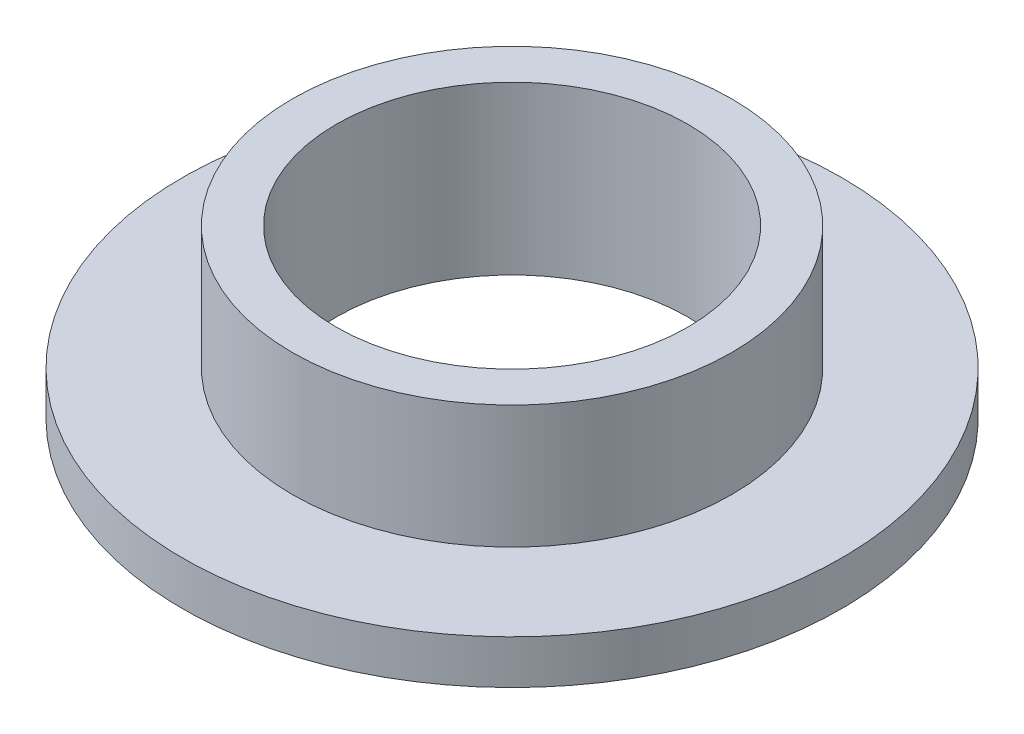
ISO-10303-21;
HEADER;
FILE_DESCRIPTION(('STEP AP214'),'2;1');
FILE_NAME('part.step','',(''),(''),'','','');
FILE_SCHEMA(('AUTOMOTIVE_DESIGN { 1 0 10303 214 1 1 1 1 }'));
ENDSEC;
DATA;
#1=APPLICATION_CONTEXT('core data for automotive mechanical design processes');
#2=APPLICATION_PROTOCOL_DEFINITION('international standard','automotive_design',2000,#1);
#3=PRODUCT_CONTEXT('',#1,'mechanical');
#4=PRODUCT('Part','Part','',(#3));
#5=PRODUCT_RELATED_PRODUCT_CATEGORY('part','',(#4));
#6=PRODUCT_DEFINITION_FORMATION('','',#4);
#7=PRODUCT_DEFINITION_CONTEXT('part definition',#1,'design');
#8=PRODUCT_DEFINITION('design','',#6,#7);
#9=PRODUCT_DEFINITION_SHAPE('','',#8);
#10=(LENGTH_UNIT() NAMED_UNIT(*) SI_UNIT(.MILLI.,.METRE.));
#11=(NAMED_UNIT(*) PLANE_ANGLE_UNIT() SI_UNIT($,.RADIAN.));
#12=(NAMED_UNIT(*) SI_UNIT($,.STERADIAN.) SOLID_ANGLE_UNIT());
#13=UNCERTAINTY_MEASURE_WITH_UNIT(LENGTH_MEASURE(1.E-05),#10,'distance_accuracy_value','');
#14=(GEOMETRIC_REPRESENTATION_CONTEXT(3) GLOBAL_UNCERTAINTY_ASSIGNED_CONTEXT((#13)) GLOBAL_UNIT_ASSIGNED_CONTEXT((#10,
#11,#12)) REPRESENTATION_CONTEXT('',''));
#15=CARTESIAN_POINT('',(0.,0.,0.));
#16=DIRECTION('',(0.,0.,1.));
#17=DIRECTION('',(1.,0.,0.));
#18=AXIS2_PLACEMENT_3D('',#15,#16,#17);
#19=CARTESIAN_POINT('',(-5.,3.8,0.));
#20=DIRECTION('',(0.,-1.,0.));
#21=DIRECTION('',(0.,0.,-1.));
#22=AXIS2_PLACEMENT_3D('',#19,#20,#21);
#23=PLANE('',#22);
#24=CARTESIAN_POINT('',(0.,3.8,0.));
#25=DIRECTION('',(0.,-1.,0.));
#26=DIRECTION('',(0.,0.,-1.));
#27=AXIS2_PLACEMENT_3D('',#24,#25,#26);
#28=CIRCLE('',#27,5.);
#29=CARTESIAN_POINT('',(0.,3.8,-5.));
#30=VERTEX_POINT('',#29);
#31=EDGE_CURVE('E54',#30,#30,#28,.T.);
#32=ORIENTED_EDGE('',*,*,#31,.F.);
#33=EDGE_LOOP('',(#32));
#34=FACE_BOUND('',#33,.T.);
#35=CARTESIAN_POINT('',(0.,3.8,0.));
#36=DIRECTION('',(0.,-1.,0.));
#37=DIRECTION('',(0.,0.,-1.));
#38=AXIS2_PLACEMENT_3D('',#35,#36,#37);
#39=CIRCLE('',#38,4.);
#40=CARTESIAN_POINT('',(0.,3.8,-4.));
#41=VERTEX_POINT('',#40);
#42=EDGE_CURVE('E10',#41,#41,#39,.T.);
#43=ORIENTED_EDGE('',*,*,#42,.T.);
#44=EDGE_LOOP('',(#43));
#45=FACE_BOUND('',#44,.T.);
#46=ADVANCED_FACE('F32',(#34,#45),#23,.F.);
#47=CARTESIAN_POINT('',(0.,0.,0.));
#48=DIRECTION('',(0.,-1.,0.));
#49=DIRECTION('',(0.,0.,-1.));
#50=AXIS2_PLACEMENT_3D('',#47,#48,#49);
#51=CYLINDRICAL_SURFACE('',#50,4.);
#52=ORIENTED_EDGE('',*,*,#42,.F.);
#53=EDGE_LOOP('',(#52));
#54=FACE_BOUND('',#53,.T.);
#55=CARTESIAN_POINT('',(0.,0.,0.));
#56=DIRECTION('',(0.,-1.,0.));
#57=DIRECTION('',(0.,0.,-1.));
#58=AXIS2_PLACEMENT_3D('',#55,#56,#57);
#59=CIRCLE('',#58,3.99999999999999);
#60=CARTESIAN_POINT('',(0.,0.,-3.99999999999999));
#61=VERTEX_POINT('',#60);
#62=EDGE_CURVE('E38',#61,#61,#59,.T.);
#63=ORIENTED_EDGE('',*,*,#62,.T.);
#64=EDGE_LOOP('',(#63));
#65=FACE_BOUND('',#64,.T.);
#66=ADVANCED_FACE('F61',(#54,#65),#51,.F.);
#67=CARTESIAN_POINT('',(-3.99999999999999,0.,0.));
#68=DIRECTION('',(0.,1.,0.));
#69=DIRECTION('',(0.,0.,1.));
#70=AXIS2_PLACEMENT_3D('',#67,#68,#69);
#71=PLANE('',#70);
#72=ORIENTED_EDGE('',*,*,#62,.F.);
#73=EDGE_LOOP('',(#72));
#74=FACE_BOUND('',#73,.T.);
#75=CARTESIAN_POINT('',(0.,0.,0.));
#76=DIRECTION('',(0.,-1.,0.));
#77=DIRECTION('',(0.,0.,-1.));
#78=AXIS2_PLACEMENT_3D('',#75,#76,#77);
#79=CIRCLE('',#78,7.5);
#80=CARTESIAN_POINT('',(0.,0.,-7.5));
#81=VERTEX_POINT('',#80);
#82=EDGE_CURVE('E42',#81,#81,#79,.T.);
#83=ORIENTED_EDGE('',*,*,#82,.T.);
#84=EDGE_LOOP('',(#83));
#85=FACE_BOUND('',#84,.T.);
#86=ADVANCED_FACE('F65',(#74,#85),#71,.F.);
#87=CARTESIAN_POINT('',(0.,0.,0.));
#88=DIRECTION('',(0.,-1.,0.));
#89=DIRECTION('',(0.,0.,-1.));
#90=AXIS2_PLACEMENT_3D('',#87,#88,#89);
#91=CYLINDRICAL_SURFACE('',#90,7.5);
#92=ORIENTED_EDGE('',*,*,#82,.F.);
#93=EDGE_LOOP('',(#92));
#94=FACE_BOUND('',#93,.T.);
#95=CARTESIAN_POINT('',(0.,1.,0.));
#96=DIRECTION('',(0.,-1.,0.));
#97=DIRECTION('',(0.,0.,-1.));
#98=AXIS2_PLACEMENT_3D('',#95,#96,#97);
#99=CIRCLE('',#98,7.5);
#100=CARTESIAN_POINT('',(0.,1.,-7.5));
#101=VERTEX_POINT('',#100);
#102=EDGE_CURVE('E46',#101,#101,#99,.T.);
#103=ORIENTED_EDGE('',*,*,#102,.T.);
#104=EDGE_LOOP('',(#103));
#105=FACE_BOUND('',#104,.T.);
#106=ADVANCED_FACE('F70',(#94,#105),#91,.T.);
#107=CARTESIAN_POINT('',(-7.5,0.999999999999999,0.));
#108=DIRECTION('',(0.,-1.,0.));
#109=DIRECTION('',(0.,0.,-1.));
#110=AXIS2_PLACEMENT_3D('',#107,#108,#109);
#111=PLANE('',#110);
#112=ORIENTED_EDGE('',*,*,#102,.F.);
#113=EDGE_LOOP('',(#112));
#114=FACE_BOUND('',#113,.T.);
#115=CARTESIAN_POINT('',(0.,0.999999999999999,0.));
#116=DIRECTION('',(0.,-1.,0.));
#117=DIRECTION('',(0.,0.,-1.));
#118=AXIS2_PLACEMENT_3D('',#115,#116,#117);
#119=CIRCLE('',#118,5.);
#120=CARTESIAN_POINT('',(0.,0.999999999999999,-5.));
#121=VERTEX_POINT('',#120);
#122=EDGE_CURVE('E51',#121,#121,#119,.T.);
#123=ORIENTED_EDGE('',*,*,#122,.T.);
#124=EDGE_LOOP('',(#123));
#125=FACE_BOUND('',#124,.T.);
#126=ADVANCED_FACE('F76',(#114,#125),#111,.F.);
#127=CARTESIAN_POINT('',(0.,0.,0.));
#128=DIRECTION('',(0.,-1.,0.));
#129=DIRECTION('',(0.,0.,-1.));
#130=AXIS2_PLACEMENT_3D('',#127,#128,#129);
#131=CYLINDRICAL_SURFACE('',#130,5.);
#132=ORIENTED_EDGE('',*,*,#122,.F.);
#133=EDGE_LOOP('',(#132));
#134=FACE_BOUND('',#133,.T.);
#135=ORIENTED_EDGE('',*,*,#31,.T.);
#136=EDGE_LOOP('',(#135));
#137=FACE_BOUND('',#136,.T.);
#138=ADVANCED_FACE('F58',(#134,#137),#131,.T.);
#139=CLOSED_SHELL('',(#46,#66,#86,#106,#126,#138));
#140=MANIFOLD_SOLID_BREP('B2',#139);
#141=ADVANCED_BREP_SHAPE_REPRESENTATION('',(#18,#140),#14);
#142=SHAPE_DEFINITION_REPRESENTATION(#9,#141);
ENDSEC;
END-ISO-10303-21;
